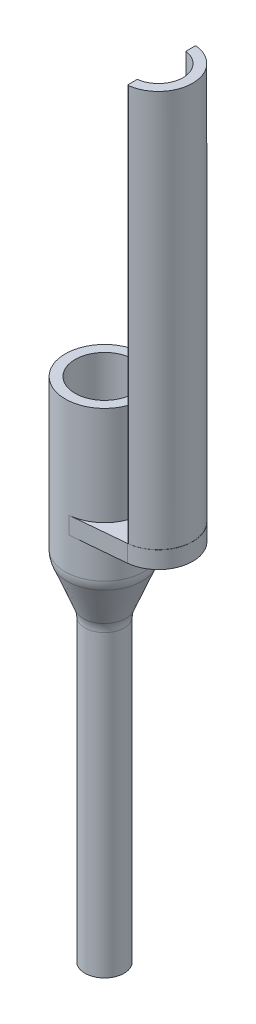
ISO-10303-21;
HEADER;
FILE_DESCRIPTION(('STEP AP214'),'2;1');
FILE_NAME('part.step','',(''),(''),'','','');
FILE_SCHEMA(('AUTOMOTIVE_DESIGN { 1 0 10303 214 1 1 1 1 }'));
ENDSEC;
DATA;
#1=APPLICATION_CONTEXT('core data for automotive mechanical design processes');
#2=APPLICATION_PROTOCOL_DEFINITION('international standard','automotive_design',2000,#1);
#3=PRODUCT_CONTEXT('',#1,'mechanical');
#4=PRODUCT('Part','Part','',(#3));
#5=PRODUCT_RELATED_PRODUCT_CATEGORY('part','',(#4));
#6=PRODUCT_DEFINITION_FORMATION('','',#4);
#7=PRODUCT_DEFINITION_CONTEXT('part definition',#1,'design');
#8=PRODUCT_DEFINITION('design','',#6,#7);
#9=PRODUCT_DEFINITION_SHAPE('','',#8);
#10=(LENGTH_UNIT() NAMED_UNIT(*) SI_UNIT(.MILLI.,.METRE.));
#11=(NAMED_UNIT(*) PLANE_ANGLE_UNIT() SI_UNIT($,.RADIAN.));
#12=(NAMED_UNIT(*) SI_UNIT($,.STERADIAN.) SOLID_ANGLE_UNIT());
#13=UNCERTAINTY_MEASURE_WITH_UNIT(LENGTH_MEASURE(1.E-05),#10,'distance_accuracy_value','');
#14=(GEOMETRIC_REPRESENTATION_CONTEXT(3) GLOBAL_UNCERTAINTY_ASSIGNED_CONTEXT((#13)) GLOBAL_UNIT_ASSIGNED_CONTEXT((#10,
#11,#12)) REPRESENTATION_CONTEXT('',''));
#15=CARTESIAN_POINT('',(0.,0.,0.));
#16=DIRECTION('',(0.,0.,1.));
#17=DIRECTION('',(1.,0.,0.));
#18=AXIS2_PLACEMENT_3D('',#15,#16,#17);
#19=CARTESIAN_POINT('',(0.,-0.7,0.));
#20=DIRECTION('',(0.,1.,0.));
#21=DIRECTION('',(0.,0.,1.));
#22=AXIS2_PLACEMENT_3D('',#19,#20,#21);
#23=CYLINDRICAL_SURFACE('',#22,8.00001344703916);
#24=CARTESIAN_POINT('',(0.,-0.7,0.));
#25=DIRECTION('',(0.,-1.,0.));
#26=DIRECTION('',(0.,0.,1.));
#27=AXIS2_PLACEMENT_3D('',#24,#25,#26);
#28=CIRCLE('',#27,8.00001344703916);
#29=CARTESIAN_POINT('',(6.6735797926521,-0.7,-4.41175111536371));
#30=VERTEX_POINT('',#29);
#31=CARTESIAN_POINT('',(6.67357979265393,-0.7,4.41175111536094));
#32=VERTEX_POINT('',#31);
#33=EDGE_CURVE('E175',#30,#32,#28,.T.);
#34=ORIENTED_EDGE('',*,*,#33,.T.);
#35=CARTESIAN_POINT('',(0.,-1.5333355745055,0.));
#36=DIRECTION('',(0.0149412061351846,-0.986393923832144,0.163718622600644));
#37=DIRECTION('',(0.0896472368111091,0.164398987305354,0.98231173560388));
#38=AXIS2_PLACEMENT_3D('',#35,#36,#37);
#39=ELLIPSE('',#38,8.11036367292194,8.00001344703916);
#40=CARTESIAN_POINT('',(0.727061916001448,-0.199999999999999,7.96690630816678));
#41=VERTEX_POINT('',#40);
#42=EDGE_CURVE('E210',#32,#41,#39,.T.);
#43=ORIENTED_EDGE('',*,*,#42,.T.);
#44=DIRECTION('',(0.,1.,0.));
#45=VECTOR('',#44,1.);
#46=CARTESIAN_POINT('',(0.727061916001448,-0.7,7.96690630816678));
#47=LINE('',#46,#45);
#48=CARTESIAN_POINT('',(0.727061916001448,3.3,7.96690630816678));
#49=VERTEX_POINT('',#48);
#50=EDGE_CURVE('E178',#41,#49,#47,.T.);
#51=ORIENTED_EDGE('',*,*,#50,.T.);
#52=CARTESIAN_POINT('',(0.,3.3,0.));
#53=DIRECTION('',(0.,-1.,0.));
#54=DIRECTION('',(0.,0.,1.));
#55=AXIS2_PLACEMENT_3D('',#52,#53,#54);
#56=CIRCLE('',#55,8.00001344703916);
#57=CARTESIAN_POINT('',(0.727071692815031,3.3,-7.96690541592621));
#58=VERTEX_POINT('',#57);
#59=EDGE_CURVE('E180',#58,#49,#56,.T.);
#60=ORIENTED_EDGE('',*,*,#59,.F.);
#61=DIRECTION('',(0.,1.,0.));
#62=VECTOR('',#61,1.);
#63=CARTESIAN_POINT('',(0.727071692815031,-0.7,-7.96690541592621));
#64=LINE('',#63,#62);
#65=CARTESIAN_POINT('',(0.727071692815031,-0.199999999999999,-7.96690541592621));
#66=VERTEX_POINT('',#65);
#67=EDGE_CURVE('E192',#66,#58,#64,.T.);
#68=ORIENTED_EDGE('',*,*,#67,.F.);
#69=CARTESIAN_POINT('',(0.,-1.5333355745065,0.));
#70=DIRECTION('',(0.0149412061352746,-0.986393923832144,-0.163718622600635));
#71=DIRECTION('',(0.0896472368116493,0.164398987305354,-0.982311735603831));
#72=AXIS2_PLACEMENT_3D('',#69,#70,#71);
#73=ELLIPSE('',#72,8.11036367292194,8.00001344703916);
#74=EDGE_CURVE('E208',#66,#30,#73,.T.);
#75=ORIENTED_EDGE('',*,*,#74,.T.);
#76=EDGE_LOOP('',(#34,#43,#51,#60,#68,#75));
#77=FACE_BOUND('',#76,.T.);
#78=ADVANCED_FACE('F48',(#77),#23,.F.);
#79=CARTESIAN_POINT('',(11.6393946021371,-0.7,-6.97103052147039));
#80=DIRECTION('',(0.0908838088371119,0.,-0.995861503067198));
#81=DIRECTION('',(-0.995861503067198,0.,-0.0908838088371119));
#82=AXIS2_PLACEMENT_3D('',#79,#80,#81);
#83=PLANE('',#82);
#84=DIRECTION('',(0.,1.,0.));
#85=VECTOR('',#84,1.);
#86=CARTESIAN_POINT('',(11.6393946021371,-0.7,-6.97103052147039));
#87=LINE('',#86,#85);
#88=CARTESIAN_POINT('',(11.6393946021371,-0.199999999999999,-6.97103052147039));
#89=VERTEX_POINT('',#88);
#90=CARTESIAN_POINT('',(11.6393946021371,3.3,-6.97103052147039));
#91=VERTEX_POINT('',#90);
#92=EDGE_CURVE('E195',#89,#91,#87,.T.);
#93=ORIENTED_EDGE('',*,*,#92,.F.);
#94=DIRECTION('',(-0.995861503067198,0.,-0.0908838088371119));
#95=VECTOR('',#94,1.);
#96=CARTESIAN_POINT('',(0.727071692815031,-0.199999999999999,-7.96690541592621));
#97=LINE('',#96,#95);
#98=EDGE_CURVE('E212',#89,#66,#97,.T.);
#99=ORIENTED_EDGE('',*,*,#98,.T.);
#100=ORIENTED_EDGE('',*,*,#67,.T.);
#101=DIRECTION('',(-0.995861503067198,0.,-0.0908838088371119));
#102=VECTOR('',#101,1.);
#103=CARTESIAN_POINT('',(11.6393946021371,3.3,-6.97103052147039));
#104=LINE('',#103,#102);
#105=EDGE_CURVE('E179',#91,#58,#104,.T.);
#106=ORIENTED_EDGE('',*,*,#105,.F.);
#107=EDGE_LOOP('',(#93,#99,#100,#106));
#108=FACE_BOUND('',#107,.T.);
#109=ADVANCED_FACE('F250',(#108),#83,.T.);
#110=CARTESIAN_POINT('',(11.0032079402774,-0.7,0.));
#111=DIRECTION('',(0.,1.,0.));
#112=DIRECTION('',(0.,0.,1.));
#113=AXIS2_PLACEMENT_3D('',#110,#111,#112);
#114=CYLINDRICAL_SURFACE('',#113,7.);
#115=DIRECTION('',(0.,1.,0.));
#116=VECTOR('',#115,1.);
#117=CARTESIAN_POINT('',(11.6393946021333,-0.7,6.97103052147074));
#118=LINE('',#117,#116);
#119=CARTESIAN_POINT('',(11.6393946021333,-0.199999999999999,6.97103052147074));
#120=VERTEX_POINT('',#119);
#121=CARTESIAN_POINT('',(11.6393946021333,3.3,6.97103052147074));
#122=VERTEX_POINT('',#121);
#123=EDGE_CURVE('E197',#120,#122,#118,.T.);
#124=ORIENTED_EDGE('',*,*,#123,.F.);
#125=CARTESIAN_POINT('',(11.0032079402774,-0.199999999999999,0.));
#126=DIRECTION('',(0.,1.,0.));
#127=DIRECTION('',(0.,0.,1.));
#128=AXIS2_PLACEMENT_3D('',#125,#126,#127);
#129=CIRCLE('',#128,7.);
#130=EDGE_CURVE('E214',#120,#89,#129,.T.);
#131=ORIENTED_EDGE('',*,*,#130,.T.);
#132=ORIENTED_EDGE('',*,*,#92,.T.);
#133=CARTESIAN_POINT('',(11.0032079402774,3.3,0.));
#134=DIRECTION('',(0.,1.,0.));
#135=DIRECTION('',(0.,0.,1.));
#136=AXIS2_PLACEMENT_3D('',#133,#134,#135);
#137=CIRCLE('',#136,7.);
#138=EDGE_CURVE('E187',#122,#91,#137,.T.);
#139=ORIENTED_EDGE('',*,*,#138,.F.);
#140=EDGE_LOOP('',(#124,#131,#132,#139));
#141=FACE_BOUND('',#140,.T.);
#142=ADVANCED_FACE('F256',(#141),#114,.T.);
#143=CARTESIAN_POINT('',(0.727061916001448,-0.7,7.96690630816678));
#144=DIRECTION('',(0.0908838088365642,0.,0.995861503067248));
#145=DIRECTION('',(0.995861503067248,0.,-0.0908838088365642));
#146=AXIS2_PLACEMENT_3D('',#143,#144,#145);
#147=PLANE('',#146);
#148=ORIENTED_EDGE('',*,*,#50,.F.);
#149=DIRECTION('',(0.995861503067248,0.,-0.0908838088365642));
#150=VECTOR('',#149,1.);
#151=CARTESIAN_POINT('',(11.6393946021333,-0.199999999999999,6.97103052147074));
#152=LINE('',#151,#150);
#153=EDGE_CURVE('E194',#41,#120,#152,.T.);
#154=ORIENTED_EDGE('',*,*,#153,.T.);
#155=ORIENTED_EDGE('',*,*,#123,.T.);
#156=DIRECTION('',(0.995861503067248,0.,-0.0908838088365642));
#157=VECTOR('',#156,1.);
#158=CARTESIAN_POINT('',(0.727061916001448,3.3,7.96690630816678));
#159=LINE('',#158,#157);
#160=EDGE_CURVE('E183',#49,#122,#159,.T.);
#161=ORIENTED_EDGE('',*,*,#160,.F.);
#162=EDGE_LOOP('',(#148,#154,#155,#161));
#163=FACE_BOUND('',#162,.T.);
#164=ADVANCED_FACE('F261',(#163),#147,.T.);
#165=CARTESIAN_POINT('',(0.,-0.7,0.));
#166=DIRECTION('',(0.,1.,0.));
#167=DIRECTION('',(0.,0.,1.));
#168=AXIS2_PLACEMENT_3D('',#165,#166,#167);
#169=PLANE('',#168);
#170=CARTESIAN_POINT('',(11.0032079402774,-0.7,0.));
#171=DIRECTION('',(0.,1.,0.));
#172=DIRECTION('',(0.,0.,1.));
#173=AXIS2_PLACEMENT_3D('',#170,#171,#172);
#174=CIRCLE('',#173,3.99999999999994);
#175=CARTESIAN_POINT('',(11.3667431756258,-0.7,-3.98344601226873));
#176=VERTEX_POINT('',#175);
#177=CARTESIAN_POINT('',(11.3667431756236,-0.7,3.98344601226893));
#178=VERTEX_POINT('',#177);
#179=EDGE_CURVE('E202',#176,#178,#174,.F.);
#180=ORIENTED_EDGE('',*,*,#179,.T.);
#181=DIRECTION('',(-0.995861503067248,0.,0.0908838088365642));
#182=VECTOR('',#181,1.);
#183=CARTESIAN_POINT('',(0.45441048949175,-0.7,4.97932179896497));
#184=LINE('',#183,#182);
#185=EDGE_CURVE('E206',#178,#32,#184,.T.);
#186=ORIENTED_EDGE('',*,*,#185,.T.);
#187=ORIENTED_EDGE('',*,*,#33,.F.);
#188=DIRECTION('',(0.995861503067198,0.,0.0908838088371119));
#189=VECTOR('',#188,1.);
#190=CARTESIAN_POINT('',(11.3667431756258,-0.7,-3.98344601226873));
#191=LINE('',#190,#189);
#192=EDGE_CURVE('E204',#30,#176,#191,.T.);
#193=ORIENTED_EDGE('',*,*,#192,.T.);
#194=EDGE_LOOP('',(#180,#186,#187,#193));
#195=FACE_BOUND('',#194,.T.);
#196=ADVANCED_FACE('F321',(#195),#169,.F.);
#197=CARTESIAN_POINT('',(0.,3.3,0.));
#198=DIRECTION('',(0.,1.,0.));
#199=DIRECTION('',(0.,0.,1.));
#200=AXIS2_PLACEMENT_3D('',#197,#198,#199);
#201=PLANE('',#200);
#202=ORIENTED_EDGE('',*,*,#160,.T.);
#203=ORIENTED_EDGE('',*,*,#138,.T.);
#204=ORIENTED_EDGE('',*,*,#105,.T.);
#205=ORIENTED_EDGE('',*,*,#59,.T.);
#206=EDGE_LOOP('',(#202,#203,#204,#205));
#207=FACE_BOUND('',#206,.T.);
#208=DIRECTION('',(-0.000334117908338337,0.,0.99999994418261));
#209=VECTOR('',#208,1.);
#210=CARTESIAN_POINT('',(11.6400667656399,3.3,4.95927523299099));
#211=LINE('',#210,#209);
#212=CARTESIAN_POINT('',(11.6400667656399,3.3,4.95927523299099));
#213=VERTEX_POINT('',#212);
#214=CARTESIAN_POINT('',(11.6394693119827,3.3,6.74742728632053));
#215=VERTEX_POINT('',#214);
#216=EDGE_CURVE('E63',#213,#215,#211,.T.);
#217=ORIENTED_EDGE('',*,*,#216,.F.);
#218=CARTESIAN_POINT('',(11.0032079402774,3.3,0.));
#219=DIRECTION('',(0.,-1.,0.));
#220=DIRECTION('',(0.,0.,1.));
#221=AXIS2_PLACEMENT_3D('',#218,#219,#220);
#222=CIRCLE('',#221,5.);
#223=CARTESIAN_POINT('',(11.6403712201603,3.3,-4.95923612613564));
#224=VERTEX_POINT('',#223);
#225=EDGE_CURVE('E171',#224,#213,#222,.T.);
#226=ORIENTED_EDGE('',*,*,#225,.F.);
#227=DIRECTION('',(0.00048544618195646,0.,0.999999882170995));
#228=VECTOR('',#227,1.);
#229=CARTESIAN_POINT('',(11.6403712201603,3.3,-4.95923612613564));
#230=LINE('',#229,#228);
#231=CARTESIAN_POINT('',(11.6395031662819,3.3,-6.74739268880654));
#232=VERTEX_POINT('',#231);
#233=EDGE_CURVE('E155',#232,#224,#230,.T.);
#234=ORIENTED_EDGE('',*,*,#233,.F.);
#235=CARTESIAN_POINT('',(11.8395031427161,3.3,-6.74748977804293));
#236=DIRECTION('',(0.,1.,0.));
#237=DIRECTION('',(0.,0.,1.));
#238=AXIS2_PLACEMENT_3D('',#235,#236,#237);
#239=CIRCLE('',#238,0.2);
#240=CARTESIAN_POINT('',(11.8648970237789,3.3,-6.94587110479666));
#241=VERTEX_POINT('',#240);
#242=EDGE_CURVE('E56',#232,#241,#239,.F.);
#243=ORIENTED_EDGE('',*,*,#242,.T.);
#244=CARTESIAN_POINT('',(10.9757880153934,3.3,0.));
#245=DIRECTION('',(0.,1.,0.));
#246=DIRECTION('',(0.,0.,1.));
#247=AXIS2_PLACEMENT_3D('',#244,#245,#246);
#248=CIRCLE('',#247,7.00254526820365);
#249=CARTESIAN_POINT('',(11.8648621869045,3.3,6.94587556401589));
#250=VERTEX_POINT('',#249);
#251=EDGE_CURVE('E70',#250,#241,#248,.T.);
#252=ORIENTED_EDGE('',*,*,#251,.F.);
#253=CARTESIAN_POINT('',(11.8394693008192,3.3,6.7474941099022));
#254=DIRECTION('',(0.,1.,0.));
#255=DIRECTION('',(0.,0.,1.));
#256=AXIS2_PLACEMENT_3D('',#253,#254,#255);
#257=CIRCLE('',#256,0.2);
#258=EDGE_CURVE('E12',#250,#215,#257,.F.);
#259=ORIENTED_EDGE('',*,*,#258,.T.);
#260=EDGE_LOOP('',(#217,#226,#234,#243,#252,#259));
#261=FACE_BOUND('',#260,.T.);
#262=ADVANCED_FACE('F231',(#207,#261),#201,.T.);
#263=CARTESIAN_POINT('',(11.6393946021371,-0.199999999999999,-6.97103052147039));
#264=DIRECTION('',(0.0149412061352746,-0.986393923832144,-0.163718622600635));
#265=DIRECTION('',(0.995861503067198,0.,0.0908838088371119));
#266=AXIS2_PLACEMENT_3D('',#263,#264,#265);
#267=PLANE('',#266);
#268=ORIENTED_EDGE('',*,*,#74,.F.);
#269=ORIENTED_EDGE('',*,*,#98,.F.);
#270=DIRECTION('',(0.0896472368116491,0.164398987305354,-0.982311735603831));
#271=VECTOR('',#270,1.);
#272=CARTESIAN_POINT('',(11.3667431756258,-0.7,-3.98344601226873));
#273=LINE('',#272,#271);
#274=EDGE_CURVE('E184',#176,#89,#273,.T.);
#275=ORIENTED_EDGE('',*,*,#274,.F.);
#276=ORIENTED_EDGE('',*,*,#192,.F.);
#277=EDGE_LOOP('',(#268,#269,#275,#276));
#278=FACE_BOUND('',#277,.T.);
#279=ADVANCED_FACE('F270',(#278),#267,.T.);
#280=CARTESIAN_POINT('',(11.0032079402774,-0.199999999999999,0.));
#281=DIRECTION('',(0.,1.,0.));
#282=DIRECTION('',(0.,0.,1.));
#283=AXIS2_PLACEMENT_3D('',#280,#281,#282);
#284=CONICAL_SURFACE('',#283,7.,1.40564764938027);
#285=ORIENTED_EDGE('',*,*,#274,.T.);
#286=ORIENTED_EDGE('',*,*,#130,.F.);
#287=DIRECTION('',(0.089647236811109,0.164398987305354,0.98231173560388));
#288=VECTOR('',#287,1.);
#289=CARTESIAN_POINT('',(11.3667431756236,-0.7,3.98344601226893));
#290=LINE('',#289,#288);
#291=EDGE_CURVE('E159',#178,#120,#290,.T.);
#292=ORIENTED_EDGE('',*,*,#291,.F.);
#293=ORIENTED_EDGE('',*,*,#179,.F.);
#294=EDGE_LOOP('',(#285,#286,#292,#293));
#295=FACE_BOUND('',#294,.T.);
#296=ADVANCED_FACE('F266',(#295),#284,.T.);
#297=CARTESIAN_POINT('',(0.727061916001448,-0.199999999999999,7.96690630816678));
#298=DIRECTION('',(0.0149412061351846,-0.986393923832144,0.163718622600644));
#299=DIRECTION('',(-0.995861503067248,0.,0.0908838088365642));
#300=AXIS2_PLACEMENT_3D('',#297,#298,#299);
#301=PLANE('',#300);
#302=ORIENTED_EDGE('',*,*,#42,.F.);
#303=ORIENTED_EDGE('',*,*,#185,.F.);
#304=ORIENTED_EDGE('',*,*,#291,.T.);
#305=ORIENTED_EDGE('',*,*,#153,.F.);
#306=EDGE_LOOP('',(#302,#303,#304,#305));
#307=FACE_BOUND('',#306,.T.);
#308=ADVANCED_FACE('F263',(#307),#301,.T.);
#309=CARTESIAN_POINT('',(10.9757880153934,84.3,0.));
#310=DIRECTION('',(0.,-1.,0.));
#311=DIRECTION('',(0.,0.,-1.));
#312=AXIS2_PLACEMENT_3D('',#309,#310,#311);
#313=CYLINDRICAL_SURFACE('',#312,7.00254526820365);
#314=ORIENTED_EDGE('',*,*,#251,.T.);
#315=DIRECTION('',(0.,-1.,0.));
#316=VECTOR('',#315,1.);
#317=CARTESIAN_POINT('',(11.8648970237789,84.3,-6.94587110479666));
#318=LINE('',#317,#316);
#319=CARTESIAN_POINT('',(11.8648970237789,84.3,-6.94587110479666));
#320=VERTEX_POINT('',#319);
#321=EDGE_CURVE('E223',#241,#320,#318,.F.);
#322=ORIENTED_EDGE('',*,*,#321,.T.);
#323=CARTESIAN_POINT('',(10.9757880153934,84.3,0.));
#324=DIRECTION('',(0.,1.,0.));
#325=DIRECTION('',(0.,0.,1.));
#326=AXIS2_PLACEMENT_3D('',#323,#324,#325);
#327=CIRCLE('',#326,7.00254526820365);
#328=CARTESIAN_POINT('',(11.8648621869045,84.3,6.94587556401589));
#329=VERTEX_POINT('',#328);
#330=EDGE_CURVE('E149',#329,#320,#327,.T.);
#331=ORIENTED_EDGE('',*,*,#330,.F.);
#332=DIRECTION('',(0.,-1.,0.));
#333=VECTOR('',#332,1.);
#334=CARTESIAN_POINT('',(11.8648621869045,84.3,6.94587556401589));
#335=LINE('',#334,#333);
#336=EDGE_CURVE('E221',#329,#250,#335,.T.);
#337=ORIENTED_EDGE('',*,*,#336,.T.);
#338=EDGE_LOOP('',(#314,#322,#331,#337));
#339=FACE_BOUND('',#338,.T.);
#340=ADVANCED_FACE('F235',(#339),#313,.T.);
#341=CARTESIAN_POINT('',(11.6403712201603,84.3,-4.95923612613564));
#342=DIRECTION('',(0.999999882170995,0.,-0.00048544618195646));
#343=DIRECTION('',(-0.00048544618195646,0.,-0.999999882170995));
#344=AXIS2_PLACEMENT_3D('',#341,#342,#343);
#345=PLANE('',#344);
#346=DIRECTION('',(0.00048544618195646,0.,0.999999882170995));
#347=VECTOR('',#346,1.);
#348=CARTESIAN_POINT('',(11.6403712201603,84.3,-4.95923612613564));
#349=LINE('',#348,#347);
#350=CARTESIAN_POINT('',(11.6395031662819,84.3,-6.74739268880654));
#351=VERTEX_POINT('',#350);
#352=CARTESIAN_POINT('',(11.6403712201603,84.3,-4.95923612613564));
#353=VERTEX_POINT('',#352);
#354=EDGE_CURVE('E136',#351,#353,#349,.T.);
#355=ORIENTED_EDGE('',*,*,#354,.F.);
#356=DIRECTION('',(0.,-1.,0.));
#357=VECTOR('',#356,1.);
#358=CARTESIAN_POINT('',(11.6395031662819,84.3,-6.74739268880654));
#359=LINE('',#358,#357);
#360=EDGE_CURVE('E216',#351,#232,#359,.T.);
#361=ORIENTED_EDGE('',*,*,#360,.T.);
#362=ORIENTED_EDGE('',*,*,#233,.T.);
#363=DIRECTION('',(0.,-1.,0.));
#364=VECTOR('',#363,1.);
#365=CARTESIAN_POINT('',(11.6403712201603,84.3,-4.95923612613564));
#366=LINE('',#365,#364);
#367=EDGE_CURVE('E152',#353,#224,#366,.T.);
#368=ORIENTED_EDGE('',*,*,#367,.F.);
#369=EDGE_LOOP('',(#355,#361,#362,#368));
#370=FACE_BOUND('',#369,.T.);
#371=ADVANCED_FACE('F153',(#370),#345,.F.);
#372=CARTESIAN_POINT('',(11.0032079402774,84.3,0.));
#373=DIRECTION('',(0.,-1.,0.));
#374=DIRECTION('',(0.,0.,-1.));
#375=AXIS2_PLACEMENT_3D('',#372,#373,#374);
#376=CYLINDRICAL_SURFACE('',#375,5.);
#377=ORIENTED_EDGE('',*,*,#225,.T.);
#378=DIRECTION('',(0.,-1.,0.));
#379=VECTOR('',#378,1.);
#380=CARTESIAN_POINT('',(11.6400667656399,84.3,4.95927523299099));
#381=LINE('',#380,#379);
#382=CARTESIAN_POINT('',(11.6400667656399,84.3,4.95927523299099));
#383=VERTEX_POINT('',#382);
#384=EDGE_CURVE('E160',#383,#213,#381,.T.);
#385=ORIENTED_EDGE('',*,*,#384,.F.);
#386=CARTESIAN_POINT('',(11.0032079402774,84.3,0.));
#387=DIRECTION('',(0.,-1.,0.));
#388=DIRECTION('',(0.,0.,1.));
#389=AXIS2_PLACEMENT_3D('',#386,#387,#388);
#390=CIRCLE('',#389,5.);
#391=EDGE_CURVE('E142',#353,#383,#390,.T.);
#392=ORIENTED_EDGE('',*,*,#391,.F.);
#393=ORIENTED_EDGE('',*,*,#367,.T.);
#394=EDGE_LOOP('',(#377,#385,#392,#393));
#395=FACE_BOUND('',#394,.T.);
#396=ADVANCED_FACE('F162',(#395),#376,.F.);
#397=CARTESIAN_POINT('',(11.6400667656399,84.3,4.95927523299099));
#398=DIRECTION('',(0.99999994418261,0.,0.000334117908338337));
#399=DIRECTION('',(0.000334117908338337,0.,-0.99999994418261));
#400=AXIS2_PLACEMENT_3D('',#397,#398,#399);
#401=PLANE('',#400);
#402=ORIENTED_EDGE('',*,*,#216,.T.);
#403=DIRECTION('',(0.,-1.,0.));
#404=VECTOR('',#403,1.);
#405=CARTESIAN_POINT('',(11.6394693119827,84.3,6.74742728632053));
#406=LINE('',#405,#404);
#407=CARTESIAN_POINT('',(11.6394693119827,84.3,6.74742728632053));
#408=VERTEX_POINT('',#407);
#409=EDGE_CURVE('E228',#215,#408,#406,.F.);
#410=ORIENTED_EDGE('',*,*,#409,.T.);
#411=DIRECTION('',(-0.000334117908338337,0.,0.99999994418261));
#412=VECTOR('',#411,1.);
#413=CARTESIAN_POINT('',(11.6400667656399,84.3,4.95927523299099));
#414=LINE('',#413,#412);
#415=EDGE_CURVE('E164',#383,#408,#414,.T.);
#416=ORIENTED_EDGE('',*,*,#415,.F.);
#417=ORIENTED_EDGE('',*,*,#384,.T.);
#418=EDGE_LOOP('',(#402,#410,#416,#417));
#419=FACE_BOUND('',#418,.T.);
#420=ADVANCED_FACE('F240',(#419),#401,.F.);
#421=CARTESIAN_POINT('',(10.9757880153934,84.3,0.));
#422=DIRECTION('',(0.,1.,0.));
#423=DIRECTION('',(0.,0.,1.));
#424=AXIS2_PLACEMENT_3D('',#421,#422,#423);
#425=PLANE('',#424);
#426=ORIENTED_EDGE('',*,*,#330,.T.);
#427=CARTESIAN_POINT('',(11.8395031427161,84.3,-6.74748977804293));
#428=DIRECTION('',(0.,1.,0.));
#429=DIRECTION('',(0.,0.,1.));
#430=AXIS2_PLACEMENT_3D('',#427,#428,#429);
#431=CIRCLE('',#430,0.2);
#432=EDGE_CURVE('E145',#320,#351,#431,.T.);
#433=ORIENTED_EDGE('',*,*,#432,.T.);
#434=ORIENTED_EDGE('',*,*,#354,.T.);
#435=ORIENTED_EDGE('',*,*,#391,.T.);
#436=ORIENTED_EDGE('',*,*,#415,.T.);
#437=CARTESIAN_POINT('',(11.8394693008192,84.3,6.7474941099022));
#438=DIRECTION('',(0.,1.,0.));
#439=DIRECTION('',(0.,0.,1.));
#440=AXIS2_PLACEMENT_3D('',#437,#438,#439);
#441=CIRCLE('',#440,0.2);
#442=EDGE_CURVE('E225',#408,#329,#441,.T.);
#443=ORIENTED_EDGE('',*,*,#442,.T.);
#444=EDGE_LOOP('',(#426,#433,#434,#435,#436,#443));
#445=FACE_BOUND('',#444,.T.);
#446=ADVANCED_FACE('F139',(#445),#425,.T.);
#447=CARTESIAN_POINT('',(11.8395031427161,84.3,-6.74748977804293));
#448=DIRECTION('',(0.,-1.,0.));
#449=DIRECTION('',(0.,0.,-1.));
#450=AXIS2_PLACEMENT_3D('',#447,#448,#449);
#451=CYLINDRICAL_SURFACE('',#450,0.2);
#452=ORIENTED_EDGE('',*,*,#432,.F.);
#453=ORIENTED_EDGE('',*,*,#321,.F.);
#454=ORIENTED_EDGE('',*,*,#242,.F.);
#455=ORIENTED_EDGE('',*,*,#360,.F.);
#456=EDGE_LOOP('',(#452,#453,#454,#455));
#457=FACE_BOUND('',#456,.T.);
#458=ADVANCED_FACE('F233',(#457),#451,.T.);
#459=CARTESIAN_POINT('',(11.8394693008192,84.3,6.7474941099022));
#460=DIRECTION('',(0.,-1.,0.));
#461=DIRECTION('',(0.,0.,-1.));
#462=AXIS2_PLACEMENT_3D('',#459,#460,#461);
#463=CYLINDRICAL_SURFACE('',#462,0.2);
#464=ORIENTED_EDGE('',*,*,#442,.F.);
#465=ORIENTED_EDGE('',*,*,#409,.F.);
#466=ORIENTED_EDGE('',*,*,#258,.F.);
#467=ORIENTED_EDGE('',*,*,#336,.F.);
#468=EDGE_LOOP('',(#464,#465,#466,#467));
#469=FACE_BOUND('',#468,.T.);
#470=ADVANCED_FACE('F50',(#469),#463,.T.);
#471=CLOSED_SHELL('',(#78,#109,#142,#164,#196,#262,#279,#296,#308,#340,#371,#396,#420,#446,#458,#470));
#472=MANIFOLD_SOLID_BREP('B2',#471);
#473=CARTESIAN_POINT('',(0.,23.5,0.));
#474=DIRECTION('',(0.,-1.,0.));
#475=DIRECTION('',(1.,0.,0.));
#476=AXIS2_PLACEMENT_3D('',#473,#474,#475);
#477=PLANE('',#476);
#478=CARTESIAN_POINT('',(0.,23.5000000000001,0.));
#479=DIRECTION('',(0.,-1.,0.));
#480=DIRECTION('',(1.,0.,0.));
#481=AXIS2_PLACEMENT_3D('',#478,#479,#480);
#482=CIRCLE('',#481,8.00000000000008);
#483=CARTESIAN_POINT('',(8.,23.5000000000001,0.));
#484=VERTEX_POINT('',#483);
#485=EDGE_CURVE('E439',#484,#484,#482,.T.);
#486=ORIENTED_EDGE('',*,*,#485,.F.);
#487=EDGE_LOOP('',(#486));
#488=FACE_BOUND('',#487,.T.);
#489=CARTESIAN_POINT('',(0.,23.5000000000001,0.));
#490=DIRECTION('',(0.,-1.,0.));
#491=DIRECTION('',(1.,0.,0.));
#492=AXIS2_PLACEMENT_3D('',#489,#490,#491);
#493=CIRCLE('',#492,6.00000000000011);
#494=CARTESIAN_POINT('',(6.00000000000003,23.5000000000001,0.));
#495=VERTEX_POINT('',#494);
#496=EDGE_CURVE('E424',#495,#495,#493,.T.);
#497=ORIENTED_EDGE('',*,*,#496,.T.);
#498=EDGE_LOOP('',(#497));
#499=FACE_BOUND('',#498,.T.);
#500=ADVANCED_FACE('F404',(#488,#499),#477,.F.);
#501=CARTESIAN_POINT('',(3.49148133884313E-12,-1000.,0.));
#502=DIRECTION('',(0.,-1.,0.));
#503=DIRECTION('',(1.,0.,0.));
#504=AXIS2_PLACEMENT_3D('',#501,#502,#503);
#505=CYLINDRICAL_SURFACE('',#504,6.00000000000006);
#506=CARTESIAN_POINT('',(0.,-8.00000000000001,0.));
#507=DIRECTION('',(0.,-1.,0.));
#508=DIRECTION('',(1.,0.,0.));
#509=AXIS2_PLACEMENT_3D('',#506,#507,#508);
#510=CIRCLE('',#509,6.);
#511=CARTESIAN_POINT('',(6.00000000000003,-7.99999999999999,0.));
#512=VERTEX_POINT('',#511);
#513=EDGE_CURVE('E427',#512,#512,#510,.T.);
#514=ORIENTED_EDGE('',*,*,#513,.T.);
#515=EDGE_LOOP('',(#514));
#516=FACE_BOUND('',#515,.T.);
#517=ORIENTED_EDGE('',*,*,#496,.F.);
#518=EDGE_LOOP('',(#517));
#519=FACE_BOUND('',#518,.T.);
#520=ADVANCED_FACE('F447',(#516,#519),#505,.F.);
#521=CARTESIAN_POINT('',(0.,-8.00000000000002,0.));
#522=DIRECTION('',(0.,-1.,0.));
#523=DIRECTION('',(1.,0.,0.));
#524=AXIS2_PLACEMENT_3D('',#521,#522,#523);
#525=PLANE('',#524);
#526=ORIENTED_EDGE('',*,*,#513,.F.);
#527=EDGE_LOOP('',(#526));
#528=FACE_BOUND('',#527,.T.);
#529=CARTESIAN_POINT('',(0.,-8.00000000000001,0.));
#530=DIRECTION('',(0.,-1.,0.));
#531=DIRECTION('',(1.,0.,0.));
#532=AXIS2_PLACEMENT_3D('',#529,#530,#531);
#533=CIRCLE('',#532,3.09999999999997);
#534=CARTESIAN_POINT('',(3.1,-8.,0.));
#535=VERTEX_POINT('',#534);
#536=EDGE_CURVE('E430',#535,#535,#533,.T.);
#537=ORIENTED_EDGE('',*,*,#536,.T.);
#538=EDGE_LOOP('',(#537));
#539=FACE_BOUND('',#538,.T.);
#540=ADVANCED_FACE('F452',(#528,#539),#525,.F.);
#541=CARTESIAN_POINT('',(3.49148133884313E-12,-1000.,0.));
#542=DIRECTION('',(0.,-1.,0.));
#543=DIRECTION('',(1.,0.,0.));
#544=AXIS2_PLACEMENT_3D('',#541,#542,#543);
#545=CYLINDRICAL_SURFACE('',#544,3.09999999999985);
#546=ORIENTED_EDGE('',*,*,#536,.F.);
#547=EDGE_LOOP('',(#546));
#548=FACE_BOUND('',#547,.T.);
#549=CARTESIAN_POINT('',(2.79318507107451E-13,-80.,0.));
#550=DIRECTION('',(0.,-1.,0.));
#551=DIRECTION('',(1.,0.,0.));
#552=AXIS2_PLACEMENT_3D('',#549,#550,#551);
#553=CIRCLE('',#552,3.09999999999972);
#554=CARTESIAN_POINT('',(3.1,-79.9999999999999,0.));
#555=VERTEX_POINT('',#554);
#556=EDGE_CURVE('E433',#555,#555,#553,.T.);
#557=ORIENTED_EDGE('',*,*,#556,.T.);
#558=EDGE_LOOP('',(#557));
#559=FACE_BOUND('',#558,.T.);
#560=ADVANCED_FACE('F458',(#548,#559),#545,.F.);
#561=CARTESIAN_POINT('',(0.,-80.,0.));
#562=DIRECTION('',(0.,-1.,0.));
#563=DIRECTION('',(1.,0.,0.));
#564=AXIS2_PLACEMENT_3D('',#561,#562,#563);
#565=PLANE('',#564);
#566=CARTESIAN_POINT('',(2.79318507107451E-13,-80.,0.));
#567=DIRECTION('',(0.,-1.,0.));
#568=DIRECTION('',(1.,0.,0.));
#569=AXIS2_PLACEMENT_3D('',#566,#567,#568);
#570=CIRCLE('',#569,3.99999999999973);
#571=CARTESIAN_POINT('',(4.00000000000001,-79.9999999999999,0.));
#572=VERTEX_POINT('',#571);
#573=EDGE_CURVE('E436',#572,#572,#570,.T.);
#574=ORIENTED_EDGE('',*,*,#573,.T.);
#575=EDGE_LOOP('',(#574));
#576=FACE_BOUND('',#575,.T.);
#577=ORIENTED_EDGE('',*,*,#556,.F.);
#578=EDGE_LOOP('',(#577));
#579=FACE_BOUND('',#578,.T.);
#580=ADVANCED_FACE('F484',(#576,#579),#565,.T.);
#581=CARTESIAN_POINT('',(3.49148133884313E-12,-1000.,0.));
#582=DIRECTION('',(0.,-1.,0.));
#583=DIRECTION('',(1.,0.,0.));
#584=AXIS2_PLACEMENT_3D('',#581,#582,#583);
#585=CYLINDRICAL_SURFACE('',#584,3.99999999999983);
#586=CARTESIAN_POINT('',(0.,-18.9629120178365,0.));
#587=DIRECTION('',(0.,-1.,0.));
#588=DIRECTION('',(1.,0.,0.));
#589=AXIS2_PLACEMENT_3D('',#586,#587,#588);
#590=CIRCLE('',#589,3.99999999999983);
#591=CARTESIAN_POINT('',(3.9999999999999,-18.9629120178365,0.));
#592=VERTEX_POINT('',#591);
#593=EDGE_CURVE('E47',#592,#592,#590,.T.);
#594=ORIENTED_EDGE('',*,*,#593,.T.);
#595=EDGE_LOOP('',(#594));
#596=FACE_BOUND('',#595,.T.);
#597=ORIENTED_EDGE('',*,*,#573,.F.);
#598=EDGE_LOOP('',(#597));
#599=FACE_BOUND('',#598,.T.);
#600=ADVANCED_FACE('F477',(#596,#599),#585,.T.);
#601=CARTESIAN_POINT('',(0.,-8.00000000000001,0.));
#602=DIRECTION('',(0.,1.,0.));
#603=DIRECTION('',(-1.,0.,0.));
#604=AXIS2_PLACEMENT_3D('',#601,#602,#603);
#605=CONICAL_SURFACE('',#604,7.99999999999997,0.380506377112368);
#606=CARTESIAN_POINT('',(0.,-8.89404136393415,0.));
#607=DIRECTION('',(0.,-1.,0.));
#608=DIRECTION('',(1.,0.,0.));
#609=AXIS2_PLACEMENT_3D('',#606,#607,#608);
#610=CIRCLE('',#609,7.64238345442631);
#611=CARTESIAN_POINT('',(7.64238345442634,-8.89404136393413,0.));
#612=VERTEX_POINT('',#611);
#613=EDGE_CURVE('E415',#612,#612,#610,.T.);
#614=ORIENTED_EDGE('',*,*,#613,.T.);
#615=EDGE_LOOP('',(#614));
#616=FACE_BOUND('',#615,.T.);
#617=CARTESIAN_POINT('',(0.,-17.105958636066,0.));
#618=DIRECTION('',(0.,1.,0.));
#619=DIRECTION('',(-1.,0.,0.));
#620=AXIS2_PLACEMENT_3D('',#617,#618,#619);
#621=CIRCLE('',#620,4.35761654557355);
#622=CARTESIAN_POINT('',(-4.35761654557349,-17.105958636066,0.));
#623=VERTEX_POINT('',#622);
#624=EDGE_CURVE('E419',#623,#623,#621,.T.);
#625=ORIENTED_EDGE('',*,*,#624,.T.);
#626=EDGE_LOOP('',(#625));
#627=FACE_BOUND('',#626,.T.);
#628=ADVANCED_FACE('F470',(#616,#627),#605,.T.);
#629=CARTESIAN_POINT('',(3.49148133884313E-12,-1000.,0.));
#630=DIRECTION('',(0.,-1.,0.));
#631=DIRECTION('',(1.,0.,0.));
#632=AXIS2_PLACEMENT_3D('',#629,#630,#631);
#633=CYLINDRICAL_SURFACE('',#632,8.00000000000003);
#634=CARTESIAN_POINT('',(0.,-7.03708798216363,0.));
#635=DIRECTION('',(0.,1.,0.));
#636=DIRECTION('',(-1.,0.,0.));
#637=AXIS2_PLACEMENT_3D('',#634,#635,#636);
#638=CIRCLE('',#637,8.00000000000003);
#639=CARTESIAN_POINT('',(-8.,-7.03708798216365,0.));
#640=VERTEX_POINT('',#639);
#641=EDGE_CURVE('E411',#640,#640,#638,.T.);
#642=ORIENTED_EDGE('',*,*,#641,.T.);
#643=EDGE_LOOP('',(#642));
#644=FACE_BOUND('',#643,.T.);
#645=ORIENTED_EDGE('',*,*,#485,.T.);
#646=EDGE_LOOP('',(#645));
#647=FACE_BOUND('',#646,.T.);
#648=ADVANCED_FACE('F443',(#644,#647),#633,.T.);
#649=CARTESIAN_POINT('',(0.,-7.03708798216363,0.));
#650=DIRECTION('',(0.,1.,0.));
#651=DIRECTION('',(-1.,0.,0.));
#652=AXIS2_PLACEMENT_3D('',#649,#650,#651);
#653=DEGENERATE_TOROIDAL_SURFACE('',#652,3.00000000000003,5.,.T.);
#654=ORIENTED_EDGE('',*,*,#641,.F.);
#655=EDGE_LOOP('',(#654));
#656=FACE_BOUND('',#655,.T.);
#657=ORIENTED_EDGE('',*,*,#613,.F.);
#658=EDGE_LOOP('',(#657));
#659=FACE_BOUND('',#658,.T.);
#660=ADVANCED_FACE('F462',(#656,#659),#653,.T.);
#661=CARTESIAN_POINT('',(0.,-18.9629120178365,0.));
#662=DIRECTION('',(0.,-1.,0.));
#663=DIRECTION('',(1.,0.,0.));
#664=AXIS2_PLACEMENT_3D('',#661,#662,#663);
#665=TOROIDAL_SURFACE('',#664,8.99999999999983,5.);
#666=ORIENTED_EDGE('',*,*,#624,.F.);
#667=EDGE_LOOP('',(#666));
#668=FACE_BOUND('',#667,.T.);
#669=ORIENTED_EDGE('',*,*,#593,.F.);
#670=EDGE_LOOP('',(#669));
#671=FACE_BOUND('',#670,.T.);
#672=ADVANCED_FACE('F406',(#668,#671),#665,.F.);
#673=CLOSED_SHELL('',(#500,#520,#540,#560,#580,#600,#628,#648,#660,#672));
#674=MANIFOLD_SOLID_BREP('B6',#673);
#675=ADVANCED_BREP_SHAPE_REPRESENTATION('',(#18,#472,#674),#14);
#676=SHAPE_DEFINITION_REPRESENTATION(#9,#675);
ENDSEC;
END-ISO-10303-21;
